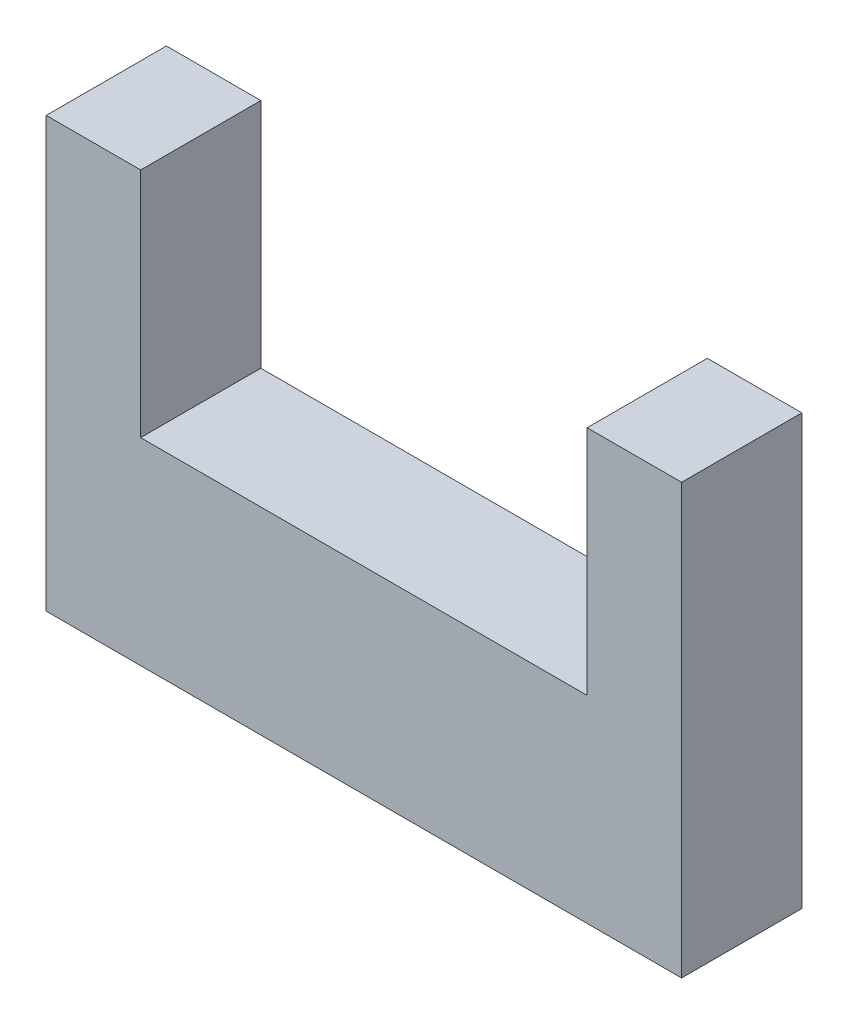
ISO-10303-21;
HEADER;
FILE_DESCRIPTION(('STEP AP214'),'2;1');
FILE_NAME('part.step','',(''),(''),'','','');
FILE_SCHEMA(('AUTOMOTIVE_DESIGN { 1 0 10303 214 1 1 1 1 }'));
ENDSEC;
DATA;
#1=APPLICATION_CONTEXT('core data for automotive mechanical design processes');
#2=APPLICATION_PROTOCOL_DEFINITION('international standard','automotive_design',2000,#1);
#3=PRODUCT_CONTEXT('',#1,'mechanical');
#4=PRODUCT('Part','Part','',(#3));
#5=PRODUCT_RELATED_PRODUCT_CATEGORY('part','',(#4));
#6=PRODUCT_DEFINITION_FORMATION('','',#4);
#7=PRODUCT_DEFINITION_CONTEXT('part definition',#1,'design');
#8=PRODUCT_DEFINITION('design','',#6,#7);
#9=PRODUCT_DEFINITION_SHAPE('','',#8);
#10=(LENGTH_UNIT() NAMED_UNIT(*) SI_UNIT(.MILLI.,.METRE.));
#11=(NAMED_UNIT(*) PLANE_ANGLE_UNIT() SI_UNIT($,.RADIAN.));
#12=(NAMED_UNIT(*) SI_UNIT($,.STERADIAN.) SOLID_ANGLE_UNIT());
#13=UNCERTAINTY_MEASURE_WITH_UNIT(LENGTH_MEASURE(1.E-05),#10,'distance_accuracy_value','');
#14=(GEOMETRIC_REPRESENTATION_CONTEXT(3) GLOBAL_UNCERTAINTY_ASSIGNED_CONTEXT((#13)) GLOBAL_UNIT_ASSIGNED_CONTEXT((#10,
#11,#12)) REPRESENTATION_CONTEXT('',''));
#15=CARTESIAN_POINT('',(0.,0.,0.));
#16=DIRECTION('',(0.,0.,1.));
#17=DIRECTION('',(1.,0.,0.));
#18=AXIS2_PLACEMENT_3D('',#15,#16,#17);
#19=CARTESIAN_POINT('',(20.,80.7608695652174,-7.));
#20=DIRECTION('',(1.,0.,0.));
#21=DIRECTION('',(0.,1.,0.));
#22=AXIS2_PLACEMENT_3D('',#19,#20,#21);
#23=PLANE('',#22);
#24=DIRECTION('',(0.,1.,0.));
#25=VECTOR('',#24,1.);
#26=CARTESIAN_POINT('',(20.,80.7608695652174,0.));
#27=LINE('',#26,#25);
#28=CARTESIAN_POINT('',(20.,55.7608695652174,0.));
#29=VERTEX_POINT('',#28);
#30=CARTESIAN_POINT('',(20.,80.7608695652174,0.));
#31=VERTEX_POINT('',#30);
#32=EDGE_CURVE('E142',#29,#31,#27,.T.);
#33=ORIENTED_EDGE('',*,*,#32,.F.);
#34=DIRECTION('',(0.,0.,1.));
#35=VECTOR('',#34,1.);
#36=CARTESIAN_POINT('',(20.,55.7608695652174,-7.));
#37=LINE('',#36,#35);
#38=CARTESIAN_POINT('',(20.,55.7608695652174,-7.));
#39=VERTEX_POINT('',#38);
#40=EDGE_CURVE('E11',#39,#29,#37,.T.);
#41=ORIENTED_EDGE('',*,*,#40,.F.);
#42=DIRECTION('',(0.,1.,0.));
#43=VECTOR('',#42,1.);
#44=CARTESIAN_POINT('',(20.,80.7608695652174,-7.));
#45=LINE('',#44,#43);
#46=CARTESIAN_POINT('',(20.,80.7608695652174,-7.));
#47=VERTEX_POINT('',#46);
#48=EDGE_CURVE('E170',#39,#47,#45,.T.);
#49=ORIENTED_EDGE('',*,*,#48,.T.);
#50=DIRECTION('',(0.,0.,1.));
#51=VECTOR('',#50,1.);
#52=CARTESIAN_POINT('',(20.,80.7608695652174,-7.));
#53=LINE('',#52,#51);
#54=EDGE_CURVE('E42',#47,#31,#53,.T.);
#55=ORIENTED_EDGE('',*,*,#54,.T.);
#56=EDGE_LOOP('',(#33,#41,#49,#55));
#57=FACE_BOUND('',#56,.T.);
#58=ADVANCED_FACE('F39',(#57),#23,.T.);
#59=CARTESIAN_POINT('',(-17.,55.7608695652174,-7.));
#60=DIRECTION('',(0.,-1.,0.));
#61=DIRECTION('',(0.,0.,-1.));
#62=AXIS2_PLACEMENT_3D('',#59,#60,#61);
#63=PLANE('',#62);
#64=DIRECTION('',(1.,0.,0.));
#65=VECTOR('',#64,1.);
#66=CARTESIAN_POINT('',(-17.,55.7608695652174,0.));
#67=LINE('',#66,#65);
#68=CARTESIAN_POINT('',(-17.,55.7608695652174,0.));
#69=VERTEX_POINT('',#68);
#70=EDGE_CURVE('E167',#69,#29,#67,.T.);
#71=ORIENTED_EDGE('',*,*,#70,.F.);
#72=DIRECTION('',(0.,0.,1.));
#73=VECTOR('',#72,1.);
#74=CARTESIAN_POINT('',(-17.,55.7608695652174,-7.));
#75=LINE('',#74,#73);
#76=CARTESIAN_POINT('',(-17.,55.7608695652174,-7.));
#77=VERTEX_POINT('',#76);
#78=EDGE_CURVE('E49',#77,#69,#75,.T.);
#79=ORIENTED_EDGE('',*,*,#78,.F.);
#80=DIRECTION('',(1.,0.,0.));
#81=VECTOR('',#80,1.);
#82=CARTESIAN_POINT('',(-17.,55.7608695652174,-7.));
#83=LINE('',#82,#81);
#84=EDGE_CURVE('E128',#77,#39,#83,.T.);
#85=ORIENTED_EDGE('',*,*,#84,.T.);
#86=ORIENTED_EDGE('',*,*,#40,.T.);
#87=EDGE_LOOP('',(#71,#79,#85,#86));
#88=FACE_BOUND('',#87,.T.);
#89=ADVANCED_FACE('F188',(#88),#63,.T.);
#90=CARTESIAN_POINT('',(-17.,55.7608695652174,-7.));
#91=DIRECTION('',(-1.,0.,0.));
#92=DIRECTION('',(0.,0.,1.));
#93=AXIS2_PLACEMENT_3D('',#90,#91,#92);
#94=PLANE('',#93);
#95=DIRECTION('',(0.,-1.,0.));
#96=VECTOR('',#95,1.);
#97=CARTESIAN_POINT('',(-17.,55.7608695652174,0.));
#98=LINE('',#97,#96);
#99=CARTESIAN_POINT('',(-17.,80.7608695652174,0.));
#100=VERTEX_POINT('',#99);
#101=EDGE_CURVE('E114',#100,#69,#98,.T.);
#102=ORIENTED_EDGE('',*,*,#101,.F.);
#103=DIRECTION('',(0.,0.,1.));
#104=VECTOR('',#103,1.);
#105=CARTESIAN_POINT('',(-17.,80.7608695652174,-7.));
#106=LINE('',#105,#104);
#107=CARTESIAN_POINT('',(-17.,80.7608695652174,-7.));
#108=VERTEX_POINT('',#107);
#109=EDGE_CURVE('E109',#108,#100,#106,.T.);
#110=ORIENTED_EDGE('',*,*,#109,.F.);
#111=DIRECTION('',(0.,-1.,0.));
#112=VECTOR('',#111,1.);
#113=CARTESIAN_POINT('',(-17.,55.7608695652174,-7.));
#114=LINE('',#113,#112);
#115=EDGE_CURVE('E112',#108,#77,#114,.T.);
#116=ORIENTED_EDGE('',*,*,#115,.T.);
#117=ORIENTED_EDGE('',*,*,#78,.T.);
#118=EDGE_LOOP('',(#102,#110,#116,#117));
#119=FACE_BOUND('',#118,.T.);
#120=ADVANCED_FACE('F111',(#119),#94,.T.);
#121=CARTESIAN_POINT('',(-17.,80.7608695652174,-7.));
#122=DIRECTION('',(0.,1.,0.));
#123=DIRECTION('',(0.,0.,1.));
#124=AXIS2_PLACEMENT_3D('',#121,#122,#123);
#125=PLANE('',#124);
#126=DIRECTION('',(-1.,0.,0.));
#127=VECTOR('',#126,1.);
#128=CARTESIAN_POINT('',(-17.,80.7608695652174,0.));
#129=LINE('',#128,#127);
#130=CARTESIAN_POINT('',(-11.5,80.7608695652174,0.));
#131=VERTEX_POINT('',#130);
#132=EDGE_CURVE('E162',#131,#100,#129,.T.);
#133=ORIENTED_EDGE('',*,*,#132,.F.);
#134=DIRECTION('',(0.,0.,1.));
#135=VECTOR('',#134,1.);
#136=CARTESIAN_POINT('',(-11.5,80.7608695652174,-7.));
#137=LINE('',#136,#135);
#138=CARTESIAN_POINT('',(-11.5,80.7608695652174,-7.));
#139=VERTEX_POINT('',#138);
#140=EDGE_CURVE('E120',#139,#131,#137,.T.);
#141=ORIENTED_EDGE('',*,*,#140,.F.);
#142=DIRECTION('',(-1.,0.,0.));
#143=VECTOR('',#142,1.);
#144=CARTESIAN_POINT('',(-17.,80.7608695652174,-7.));
#145=LINE('',#144,#143);
#146=EDGE_CURVE('E126',#139,#108,#145,.T.);
#147=ORIENTED_EDGE('',*,*,#146,.T.);
#148=ORIENTED_EDGE('',*,*,#109,.T.);
#149=EDGE_LOOP('',(#133,#141,#147,#148));
#150=FACE_BOUND('',#149,.T.);
#151=ADVANCED_FACE('F131',(#150),#125,.T.);
#152=CARTESIAN_POINT('',(-11.5,80.7608695652174,-7.));
#153=DIRECTION('',(1.,0.,0.));
#154=DIRECTION('',(0.,1.,0.));
#155=AXIS2_PLACEMENT_3D('',#152,#153,#154);
#156=PLANE('',#155);
#157=DIRECTION('',(0.,1.,0.));
#158=VECTOR('',#157,1.);
#159=CARTESIAN_POINT('',(-11.5,80.7608695652174,0.));
#160=LINE('',#159,#158);
#161=CARTESIAN_POINT('',(-11.5,67.2608695652174,0.));
#162=VERTEX_POINT('',#161);
#163=EDGE_CURVE('E158',#162,#131,#160,.T.);
#164=ORIENTED_EDGE('',*,*,#163,.F.);
#165=DIRECTION('',(0.,0.,1.));
#166=VECTOR('',#165,1.);
#167=CARTESIAN_POINT('',(-11.5,67.2608695652174,-7.));
#168=LINE('',#167,#166);
#169=CARTESIAN_POINT('',(-11.5,67.2608695652174,-7.));
#170=VERTEX_POINT('',#169);
#171=EDGE_CURVE('E176',#170,#162,#168,.T.);
#172=ORIENTED_EDGE('',*,*,#171,.F.);
#173=DIRECTION('',(0.,1.,0.));
#174=VECTOR('',#173,1.);
#175=CARTESIAN_POINT('',(-11.5,80.7608695652174,-7.));
#176=LINE('',#175,#174);
#177=EDGE_CURVE('E133',#170,#139,#176,.T.);
#178=ORIENTED_EDGE('',*,*,#177,.T.);
#179=ORIENTED_EDGE('',*,*,#140,.T.);
#180=EDGE_LOOP('',(#164,#172,#178,#179));
#181=FACE_BOUND('',#180,.T.);
#182=ADVANCED_FACE('F201',(#181),#156,.T.);
#183=CARTESIAN_POINT('',(-11.5,67.2608695652174,-7.));
#184=DIRECTION('',(0.,1.,0.));
#185=DIRECTION('',(0.,0.,1.));
#186=AXIS2_PLACEMENT_3D('',#183,#184,#185);
#187=PLANE('',#186);
#188=DIRECTION('',(-1.,0.,0.));
#189=VECTOR('',#188,1.);
#190=CARTESIAN_POINT('',(-11.5,67.2608695652174,0.));
#191=LINE('',#190,#189);
#192=CARTESIAN_POINT('',(14.5,67.2608695652174,0.));
#193=VERTEX_POINT('',#192);
#194=EDGE_CURVE('E154',#193,#162,#191,.T.);
#195=ORIENTED_EDGE('',*,*,#194,.F.);
#196=DIRECTION('',(0.,0.,1.));
#197=VECTOR('',#196,1.);
#198=CARTESIAN_POINT('',(14.5,67.2608695652174,-7.));
#199=LINE('',#198,#197);
#200=CARTESIAN_POINT('',(14.5,67.2608695652174,-7.));
#201=VERTEX_POINT('',#200);
#202=EDGE_CURVE('E179',#201,#193,#199,.T.);
#203=ORIENTED_EDGE('',*,*,#202,.F.);
#204=DIRECTION('',(-1.,0.,0.));
#205=VECTOR('',#204,1.);
#206=CARTESIAN_POINT('',(-11.5,67.2608695652174,-7.));
#207=LINE('',#206,#205);
#208=EDGE_CURVE('E136',#201,#170,#207,.T.);
#209=ORIENTED_EDGE('',*,*,#208,.T.);
#210=ORIENTED_EDGE('',*,*,#171,.T.);
#211=EDGE_LOOP('',(#195,#203,#209,#210));
#212=FACE_BOUND('',#211,.T.);
#213=ADVANCED_FACE('F204',(#212),#187,.T.);
#214=CARTESIAN_POINT('',(14.5,67.2608695652174,-7.));
#215=DIRECTION('',(-1.,0.,0.));
#216=DIRECTION('',(0.,-1.,0.));
#217=AXIS2_PLACEMENT_3D('',#214,#215,#216);
#218=PLANE('',#217);
#219=DIRECTION('',(0.,-1.,0.));
#220=VECTOR('',#219,1.);
#221=CARTESIAN_POINT('',(14.5,67.2608695652174,0.));
#222=LINE('',#221,#220);
#223=CARTESIAN_POINT('',(14.5,80.7608695652174,0.));
#224=VERTEX_POINT('',#223);
#225=EDGE_CURVE('E150',#224,#193,#222,.T.);
#226=ORIENTED_EDGE('',*,*,#225,.F.);
#227=DIRECTION('',(0.,0.,1.));
#228=VECTOR('',#227,1.);
#229=CARTESIAN_POINT('',(14.5,80.7608695652174,-7.));
#230=LINE('',#229,#228);
#231=CARTESIAN_POINT('',(14.5,80.7608695652174,-7.));
#232=VERTEX_POINT('',#231);
#233=EDGE_CURVE('E181',#232,#224,#230,.T.);
#234=ORIENTED_EDGE('',*,*,#233,.F.);
#235=DIRECTION('',(0.,-1.,0.));
#236=VECTOR('',#235,1.);
#237=CARTESIAN_POINT('',(14.5,67.2608695652174,-7.));
#238=LINE('',#237,#236);
#239=EDGE_CURVE('E279',#232,#201,#238,.T.);
#240=ORIENTED_EDGE('',*,*,#239,.T.);
#241=ORIENTED_EDGE('',*,*,#202,.T.);
#242=EDGE_LOOP('',(#226,#234,#240,#241));
#243=FACE_BOUND('',#242,.T.);
#244=ADVANCED_FACE('F208',(#243),#218,.T.);
#245=CARTESIAN_POINT('',(14.5,80.7608695652174,-7.));
#246=DIRECTION('',(0.,1.,0.));
#247=DIRECTION('',(0.,0.,1.));
#248=AXIS2_PLACEMENT_3D('',#245,#246,#247);
#249=PLANE('',#248);
#250=DIRECTION('',(-1.,0.,0.));
#251=VECTOR('',#250,1.);
#252=CARTESIAN_POINT('',(14.5,80.7608695652174,0.));
#253=LINE('',#252,#251);
#254=EDGE_CURVE('E146',#31,#224,#253,.T.);
#255=ORIENTED_EDGE('',*,*,#254,.F.);
#256=ORIENTED_EDGE('',*,*,#54,.F.);
#257=DIRECTION('',(-1.,0.,0.));
#258=VECTOR('',#257,1.);
#259=CARTESIAN_POINT('',(14.5,80.7608695652174,-7.));
#260=LINE('',#259,#258);
#261=EDGE_CURVE('E282',#47,#232,#260,.T.);
#262=ORIENTED_EDGE('',*,*,#261,.T.);
#263=ORIENTED_EDGE('',*,*,#233,.T.);
#264=EDGE_LOOP('',(#255,#256,#262,#263));
#265=FACE_BOUND('',#264,.T.);
#266=ADVANCED_FACE('F185',(#265),#249,.T.);
#267=CARTESIAN_POINT('',(0.,0.,-7.));
#268=DIRECTION('',(0.,0.,1.));
#269=DIRECTION('',(1.,0.,0.));
#270=AXIS2_PLACEMENT_3D('',#267,#268,#269);
#271=PLANE('',#270);
#272=ORIENTED_EDGE('',*,*,#48,.F.);
#273=ORIENTED_EDGE('',*,*,#84,.F.);
#274=ORIENTED_EDGE('',*,*,#115,.F.);
#275=ORIENTED_EDGE('',*,*,#146,.F.);
#276=ORIENTED_EDGE('',*,*,#177,.F.);
#277=ORIENTED_EDGE('',*,*,#208,.F.);
#278=ORIENTED_EDGE('',*,*,#239,.F.);
#279=ORIENTED_EDGE('',*,*,#261,.F.);
#280=EDGE_LOOP('',(#272,#273,#274,#275,#276,#277,#278,#279));
#281=FACE_BOUND('',#280,.T.);
#282=ADVANCED_FACE('F124',(#281),#271,.F.);
#283=CARTESIAN_POINT('',(0.,0.,0.));
#284=DIRECTION('',(0.,0.,1.));
#285=DIRECTION('',(1.,0.,0.));
#286=AXIS2_PLACEMENT_3D('',#283,#284,#285);
#287=PLANE('',#286);
#288=ORIENTED_EDGE('',*,*,#32,.T.);
#289=ORIENTED_EDGE('',*,*,#254,.T.);
#290=ORIENTED_EDGE('',*,*,#225,.T.);
#291=ORIENTED_EDGE('',*,*,#194,.T.);
#292=ORIENTED_EDGE('',*,*,#163,.T.);
#293=ORIENTED_EDGE('',*,*,#132,.T.);
#294=ORIENTED_EDGE('',*,*,#101,.T.);
#295=ORIENTED_EDGE('',*,*,#70,.T.);
#296=EDGE_LOOP('',(#288,#289,#290,#291,#292,#293,#294,#295));
#297=FACE_BOUND('',#296,.T.);
#298=ADVANCED_FACE('F187',(#297),#287,.T.);
#299=CLOSED_SHELL('',(#58,#89,#120,#151,#182,#213,#244,#266,#282,#298));
#300=MANIFOLD_SOLID_BREP('B2',#299);
#301=ADVANCED_BREP_SHAPE_REPRESENTATION('',(#18,#300),#14);
#302=SHAPE_DEFINITION_REPRESENTATION(#9,#301);
ENDSEC;
END-ISO-10303-21;
